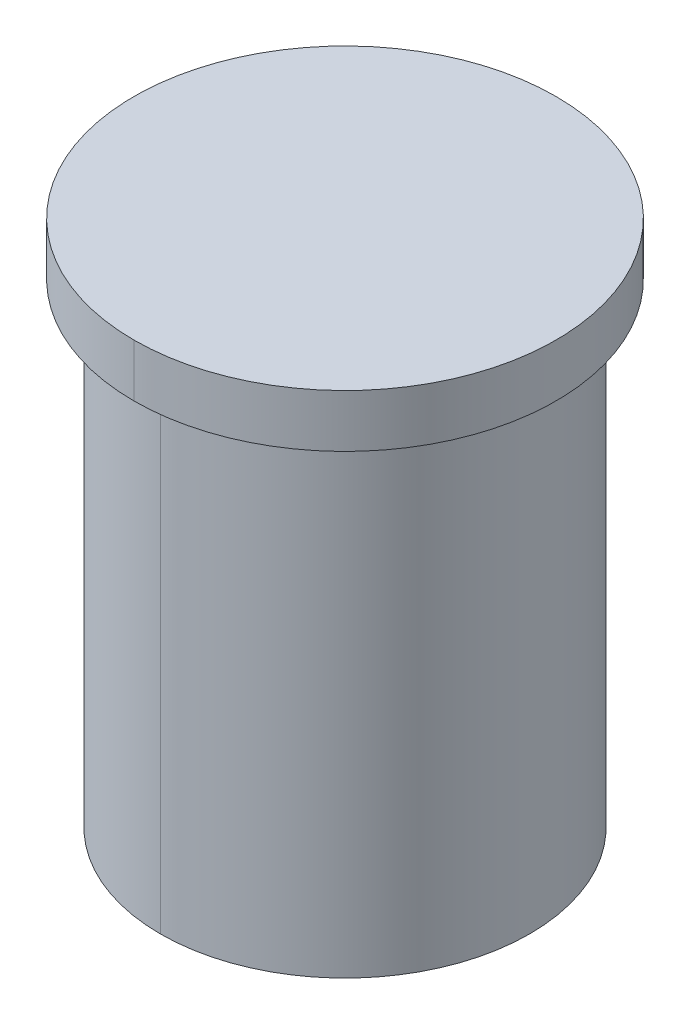
ISO-10303-21;
HEADER;
FILE_DESCRIPTION(('STEP AP214'),'2;1');
FILE_NAME('part.step','',(''),(''),'','','');
FILE_SCHEMA(('AUTOMOTIVE_DESIGN { 1 0 10303 214 1 1 1 1 }'));
ENDSEC;
DATA;
#1=APPLICATION_CONTEXT('core data for automotive mechanical design processes');
#2=APPLICATION_PROTOCOL_DEFINITION('international standard','automotive_design',2000,#1);
#3=PRODUCT_CONTEXT('',#1,'mechanical');
#4=PRODUCT('Part','Part','',(#3));
#5=PRODUCT_RELATED_PRODUCT_CATEGORY('part','',(#4));
#6=PRODUCT_DEFINITION_FORMATION('','',#4);
#7=PRODUCT_DEFINITION_CONTEXT('part definition',#1,'design');
#8=PRODUCT_DEFINITION('design','',#6,#7);
#9=PRODUCT_DEFINITION_SHAPE('','',#8);
#10=(LENGTH_UNIT() NAMED_UNIT(*) SI_UNIT(.MILLI.,.METRE.));
#11=(NAMED_UNIT(*) PLANE_ANGLE_UNIT() SI_UNIT($,.RADIAN.));
#12=(NAMED_UNIT(*) SI_UNIT($,.STERADIAN.) SOLID_ANGLE_UNIT());
#13=UNCERTAINTY_MEASURE_WITH_UNIT(LENGTH_MEASURE(1.E-05),#10,'distance_accuracy_value','');
#14=(GEOMETRIC_REPRESENTATION_CONTEXT(3) GLOBAL_UNCERTAINTY_ASSIGNED_CONTEXT((#13)) GLOBAL_UNIT_ASSIGNED_CONTEXT((#10,
#11,#12)) REPRESENTATION_CONTEXT('',''));
#15=CARTESIAN_POINT('',(0.,0.,0.));
#16=DIRECTION('',(0.,0.,1.));
#17=DIRECTION('',(1.,0.,0.));
#18=AXIS2_PLACEMENT_3D('',#15,#16,#17);
#19=CARTESIAN_POINT('',(0.,4.,1.6));
#20=DIRECTION('',(0.,1.,0.));
#21=DIRECTION('',(0.,0.,-1.));
#22=AXIS2_PLACEMENT_3D('',#19,#20,#21);
#23=PLANE('',#22);
#24=CARTESIAN_POINT('',(0.,4.,0.));
#25=DIRECTION('',(0.,1.,0.));
#26=DIRECTION('',(0.,0.,1.));
#27=AXIS2_PLACEMENT_3D('',#24,#25,#26);
#28=CIRCLE('',#27,1.6);
#29=CARTESIAN_POINT('',(0.,4.,1.6));
#30=VERTEX_POINT('',#29);
#31=CARTESIAN_POINT('',(0.,4.,-1.6));
#32=VERTEX_POINT('',#31);
#33=EDGE_CURVE('E89',#30,#32,#28,.T.);
#34=ORIENTED_EDGE('',*,*,#33,.T.);
#35=CARTESIAN_POINT('',(0.,4.,0.));
#36=DIRECTION('',(0.,1.,0.));
#37=DIRECTION('',(0.,0.,1.));
#38=AXIS2_PLACEMENT_3D('',#35,#36,#37);
#39=CIRCLE('',#38,1.6);
#40=EDGE_CURVE('E11',#32,#30,#39,.T.);
#41=ORIENTED_EDGE('',*,*,#40,.T.);
#42=EDGE_LOOP('',(#34,#41));
#43=FACE_BOUND('',#42,.T.);
#44=ADVANCED_FACE('F17',(#43),#23,.T.);
#45=CARTESIAN_POINT('',(0.,4.,0.));
#46=DIRECTION('',(0.,1.,0.));
#47=DIRECTION('',(0.,0.,1.));
#48=AXIS2_PLACEMENT_3D('',#45,#46,#47);
#49=CYLINDRICAL_SURFACE('',#48,1.6);
#50=DIRECTION('',(0.,1.,0.));
#51=VECTOR('',#50,1.);
#52=CARTESIAN_POINT('',(0.,4.,-1.6));
#53=LINE('',#52,#51);
#54=CARTESIAN_POINT('',(0.,3.6,-1.6));
#55=VERTEX_POINT('',#54);
#56=EDGE_CURVE('E79',#55,#32,#53,.T.);
#57=ORIENTED_EDGE('',*,*,#56,.F.);
#58=CARTESIAN_POINT('',(0.,3.6,0.));
#59=DIRECTION('',(0.,1.,0.));
#60=DIRECTION('',(0.,0.,1.));
#61=AXIS2_PLACEMENT_3D('',#58,#59,#60);
#62=CIRCLE('',#61,1.6);
#63=CARTESIAN_POINT('',(0.,3.6,1.6));
#64=VERTEX_POINT('',#63);
#65=EDGE_CURVE('E30',#55,#64,#62,.T.);
#66=ORIENTED_EDGE('',*,*,#65,.T.);
#67=DIRECTION('',(0.,1.,0.));
#68=VECTOR('',#67,1.);
#69=CARTESIAN_POINT('',(0.,4.,1.6));
#70=LINE('',#69,#68);
#71=EDGE_CURVE('E80',#64,#30,#70,.T.);
#72=ORIENTED_EDGE('',*,*,#71,.T.);
#73=ORIENTED_EDGE('',*,*,#40,.F.);
#74=EDGE_LOOP('',(#57,#66,#72,#73));
#75=FACE_BOUND('',#74,.T.);
#76=ADVANCED_FACE('F76',(#75),#49,.T.);
#77=CARTESIAN_POINT('',(0.,3.6,1.4));
#78=DIRECTION('',(0.,-1.,0.));
#79=DIRECTION('',(-1.,0.,0.));
#80=AXIS2_PLACEMENT_3D('',#77,#78,#79);
#81=PLANE('',#80);
#82=CARTESIAN_POINT('',(0.,3.6,0.));
#83=DIRECTION('',(0.,1.,0.));
#84=DIRECTION('',(0.,0.,1.));
#85=AXIS2_PLACEMENT_3D('',#82,#83,#84);
#86=CIRCLE('',#85,1.4);
#87=CARTESIAN_POINT('',(0.,3.6,1.4));
#88=VERTEX_POINT('',#87);
#89=CARTESIAN_POINT('',(0.,3.6,-1.4));
#90=VERTEX_POINT('',#89);
#91=EDGE_CURVE('E109',#88,#90,#86,.T.);
#92=ORIENTED_EDGE('',*,*,#91,.T.);
#93=CARTESIAN_POINT('',(0.,3.6,0.));
#94=DIRECTION('',(0.,1.,0.));
#95=DIRECTION('',(0.,0.,1.));
#96=AXIS2_PLACEMENT_3D('',#93,#94,#95);
#97=CIRCLE('',#96,1.4);
#98=EDGE_CURVE('E37',#90,#88,#97,.T.);
#99=ORIENTED_EDGE('',*,*,#98,.T.);
#100=EDGE_LOOP('',(#92,#99));
#101=FACE_BOUND('',#100,.T.);
#102=CARTESIAN_POINT('',(0.,3.6,0.));
#103=DIRECTION('',(0.,1.,0.));
#104=DIRECTION('',(0.,0.,1.));
#105=AXIS2_PLACEMENT_3D('',#102,#103,#104);
#106=CIRCLE('',#105,1.6);
#107=EDGE_CURVE('E86',#64,#55,#106,.T.);
#108=ORIENTED_EDGE('',*,*,#107,.F.);
#109=ORIENTED_EDGE('',*,*,#65,.F.);
#110=EDGE_LOOP('',(#108,#109));
#111=FACE_BOUND('',#110,.T.);
#112=ADVANCED_FACE('F19',(#101,#111),#81,.T.);
#113=CARTESIAN_POINT('',(0.,4.,0.));
#114=DIRECTION('',(0.,1.,0.));
#115=DIRECTION('',(0.,0.,1.));
#116=AXIS2_PLACEMENT_3D('',#113,#114,#115);
#117=CYLINDRICAL_SURFACE('',#116,1.4);
#118=DIRECTION('',(0.,1.,0.));
#119=VECTOR('',#118,1.);
#120=CARTESIAN_POINT('',(0.,4.,-1.4));
#121=LINE('',#120,#119);
#122=CARTESIAN_POINT('',(0.,0.,-1.4));
#123=VERTEX_POINT('',#122);
#124=EDGE_CURVE('E104',#123,#90,#121,.T.);
#125=ORIENTED_EDGE('',*,*,#124,.F.);
#126=CARTESIAN_POINT('',(0.,0.,0.));
#127=DIRECTION('',(0.,1.,0.));
#128=DIRECTION('',(0.,0.,1.));
#129=AXIS2_PLACEMENT_3D('',#126,#127,#128);
#130=CIRCLE('',#129,1.4);
#131=CARTESIAN_POINT('',(0.,0.,1.4));
#132=VERTEX_POINT('',#131);
#133=EDGE_CURVE('E21',#123,#132,#130,.T.);
#134=ORIENTED_EDGE('',*,*,#133,.T.);
#135=DIRECTION('',(0.,1.,0.));
#136=VECTOR('',#135,1.);
#137=CARTESIAN_POINT('',(0.,4.,1.4));
#138=LINE('',#137,#136);
#139=EDGE_CURVE('E111',#132,#88,#138,.T.);
#140=ORIENTED_EDGE('',*,*,#139,.T.);
#141=ORIENTED_EDGE('',*,*,#98,.F.);
#142=EDGE_LOOP('',(#125,#134,#140,#141));
#143=FACE_BOUND('',#142,.T.);
#144=ADVANCED_FACE('F122',(#143),#117,.T.);
#145=CARTESIAN_POINT('',(0.,0.,0.));
#146=DIRECTION('',(0.,-1.,0.));
#147=DIRECTION('',(-1.,0.,0.));
#148=AXIS2_PLACEMENT_3D('',#145,#146,#147);
#149=PLANE('',#148);
#150=CARTESIAN_POINT('',(0.,0.,0.));
#151=DIRECTION('',(0.,1.,0.));
#152=DIRECTION('',(0.,0.,1.));
#153=AXIS2_PLACEMENT_3D('',#150,#151,#152);
#154=CIRCLE('',#153,1.4);
#155=EDGE_CURVE('E95',#132,#123,#154,.T.);
#156=ORIENTED_EDGE('',*,*,#155,.F.);
#157=ORIENTED_EDGE('',*,*,#133,.F.);
#158=EDGE_LOOP('',(#156,#157));
#159=FACE_BOUND('',#158,.T.);
#160=ADVANCED_FACE('F127',(#159),#149,.T.);
#161=CARTESIAN_POINT('',(0.,4.,0.));
#162=DIRECTION('',(0.,1.,0.));
#163=DIRECTION('',(0.,0.,1.));
#164=AXIS2_PLACEMENT_3D('',#161,#162,#163);
#165=CYLINDRICAL_SURFACE('',#164,1.4);
#166=ORIENTED_EDGE('',*,*,#155,.T.);
#167=ORIENTED_EDGE('',*,*,#124,.T.);
#168=ORIENTED_EDGE('',*,*,#91,.F.);
#169=ORIENTED_EDGE('',*,*,#139,.F.);
#170=EDGE_LOOP('',(#166,#167,#168,#169));
#171=FACE_BOUND('',#170,.T.);
#172=ADVANCED_FACE('F128',(#171),#165,.T.);
#173=CARTESIAN_POINT('',(0.,4.,0.));
#174=DIRECTION('',(0.,1.,0.));
#175=DIRECTION('',(0.,0.,1.));
#176=AXIS2_PLACEMENT_3D('',#173,#174,#175);
#177=CYLINDRICAL_SURFACE('',#176,1.6);
#178=ORIENTED_EDGE('',*,*,#107,.T.);
#179=ORIENTED_EDGE('',*,*,#56,.T.);
#180=ORIENTED_EDGE('',*,*,#33,.F.);
#181=ORIENTED_EDGE('',*,*,#71,.F.);
#182=EDGE_LOOP('',(#178,#179,#180,#181));
#183=FACE_BOUND('',#182,.T.);
#184=ADVANCED_FACE('F87',(#183),#177,.T.);
#185=CLOSED_SHELL('',(#44,#76,#112,#144,#160,#172,#184));
#186=MANIFOLD_SOLID_BREP('B1',#185);
#187=ADVANCED_BREP_SHAPE_REPRESENTATION('',(#18,#186),#14);
#188=SHAPE_DEFINITION_REPRESENTATION(#9,#187);
ENDSEC;
END-ISO-10303-21;
